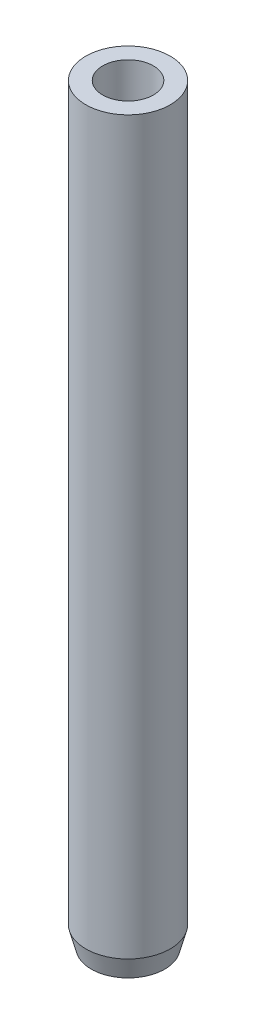
ISO-10303-21;
HEADER;
FILE_DESCRIPTION(('STEP AP214'),'2;1');
FILE_NAME('part.step','',(''),(''),'','','');
FILE_SCHEMA(('AUTOMOTIVE_DESIGN { 1 0 10303 214 1 1 1 1 }'));
ENDSEC;
DATA;
#1=APPLICATION_CONTEXT('core data for automotive mechanical design processes');
#2=APPLICATION_PROTOCOL_DEFINITION('international standard','automotive_design',2000,#1);
#3=PRODUCT_CONTEXT('',#1,'mechanical');
#4=PRODUCT('Part','Part','',(#3));
#5=PRODUCT_RELATED_PRODUCT_CATEGORY('part','',(#4));
#6=PRODUCT_DEFINITION_FORMATION('','',#4);
#7=PRODUCT_DEFINITION_CONTEXT('part definition',#1,'design');
#8=PRODUCT_DEFINITION('design','',#6,#7);
#9=PRODUCT_DEFINITION_SHAPE('','',#8);
#10=(LENGTH_UNIT() NAMED_UNIT(*) SI_UNIT(.MILLI.,.METRE.));
#11=(NAMED_UNIT(*) PLANE_ANGLE_UNIT() SI_UNIT($,.RADIAN.));
#12=(NAMED_UNIT(*) SI_UNIT($,.STERADIAN.) SOLID_ANGLE_UNIT());
#13=UNCERTAINTY_MEASURE_WITH_UNIT(LENGTH_MEASURE(1.E-05),#10,'distance_accuracy_value','');
#14=(GEOMETRIC_REPRESENTATION_CONTEXT(3) GLOBAL_UNCERTAINTY_ASSIGNED_CONTEXT((#13)) GLOBAL_UNIT_ASSIGNED_CONTEXT((#10,
#11,#12)) REPRESENTATION_CONTEXT('',''));
#15=CARTESIAN_POINT('',(0.,0.,0.));
#16=DIRECTION('',(0.,0.,1.));
#17=DIRECTION('',(1.,0.,0.));
#18=AXIS2_PLACEMENT_3D('',#15,#16,#17);
#19=CARTESIAN_POINT('',(0.,4.4956921938165,0.));
#20=DIRECTION('',(0.,-1.,0.));
#21=DIRECTION('',(-1.,0.,0.));
#22=AXIS2_PLACEMENT_3D('',#19,#20,#21);
#23=SPHERICAL_SURFACE('',#22,4.9956921938165);
#24=CARTESIAN_POINT('',(0.,0.,0.));
#25=DIRECTION('',(0.,-1.,0.));
#26=DIRECTION('',(0.,0.,-1.));
#27=AXIS2_PLACEMENT_3D('',#24,#25,#26);
#28=CIRCLE('',#27,2.17846096908265);
#29=CARTESIAN_POINT('',(0.,0.,-2.17846096908265));
#30=VERTEX_POINT('',#29);
#31=EDGE_CURVE('E10',#30,#30,#28,.T.);
#32=ORIENTED_EDGE('',*,*,#31,.T.);
#33=EDGE_LOOP('',(#32));
#34=FACE_BOUND('',#33,.T.);
#35=ADVANCED_FACE('F35',(#34),#23,.T.);
#36=CARTESIAN_POINT('',(0.,1.2,0.));
#37=DIRECTION('',(0.,1.,0.));
#38=DIRECTION('',(0.,0.,1.));
#39=AXIS2_PLACEMENT_3D('',#36,#37,#38);
#40=CONICAL_SURFACE('',#39,2.49999999999999,0.26179938779915);
#41=ORIENTED_EDGE('',*,*,#31,.F.);
#42=EDGE_LOOP('',(#41));
#43=FACE_BOUND('',#42,.T.);
#44=CARTESIAN_POINT('',(0.,1.2,0.));
#45=DIRECTION('',(0.,-1.,0.));
#46=DIRECTION('',(0.,0.,-1.));
#47=AXIS2_PLACEMENT_3D('',#44,#45,#46);
#48=CIRCLE('',#47,2.49999999999999);
#49=CARTESIAN_POINT('',(0.,1.2,-2.49999999999999));
#50=VERTEX_POINT('',#49);
#51=EDGE_CURVE('E41',#50,#50,#48,.T.);
#52=ORIENTED_EDGE('',*,*,#51,.T.);
#53=EDGE_LOOP('',(#52));
#54=FACE_BOUND('',#53,.T.);
#55=ADVANCED_FACE('F70',(#43,#54),#40,.T.);
#56=CARTESIAN_POINT('',(0.,0.,0.));
#57=DIRECTION('',(0.,-1.,0.));
#58=DIRECTION('',(0.,0.,-1.));
#59=AXIS2_PLACEMENT_3D('',#56,#57,#58);
#60=CYLINDRICAL_SURFACE('',#59,2.5);
#61=ORIENTED_EDGE('',*,*,#51,.F.);
#62=EDGE_LOOP('',(#61));
#63=FACE_BOUND('',#62,.T.);
#64=CARTESIAN_POINT('',(0.,44.5,0.));
#65=DIRECTION('',(0.,-1.,0.));
#66=DIRECTION('',(0.,0.,-1.));
#67=AXIS2_PLACEMENT_3D('',#64,#65,#66);
#68=CIRCLE('',#67,2.5);
#69=CARTESIAN_POINT('',(0.,44.5,-2.5));
#70=VERTEX_POINT('',#69);
#71=EDGE_CURVE('E45',#70,#70,#68,.T.);
#72=ORIENTED_EDGE('',*,*,#71,.T.);
#73=EDGE_LOOP('',(#72));
#74=FACE_BOUND('',#73,.T.);
#75=ADVANCED_FACE('F74',(#63,#74),#60,.T.);
#76=CARTESIAN_POINT('',(-1.5,44.5,0.));
#77=DIRECTION('',(0.,-1.,0.));
#78=DIRECTION('',(0.,0.,-1.));
#79=AXIS2_PLACEMENT_3D('',#76,#77,#78);
#80=PLANE('',#79);
#81=ORIENTED_EDGE('',*,*,#71,.F.);
#82=EDGE_LOOP('',(#81));
#83=FACE_BOUND('',#82,.T.);
#84=CARTESIAN_POINT('',(0.,44.5,0.));
#85=DIRECTION('',(0.,-1.,0.));
#86=DIRECTION('',(0.,0.,-1.));
#87=AXIS2_PLACEMENT_3D('',#84,#85,#86);
#88=CIRCLE('',#87,1.5);
#89=CARTESIAN_POINT('',(0.,44.5,-1.5));
#90=VERTEX_POINT('',#89);
#91=EDGE_CURVE('E49',#90,#90,#88,.T.);
#92=ORIENTED_EDGE('',*,*,#91,.T.);
#93=EDGE_LOOP('',(#92));
#94=FACE_BOUND('',#93,.T.);
#95=ADVANCED_FACE('F66',(#83,#94),#80,.F.);
#96=CARTESIAN_POINT('',(0.,0.,0.));
#97=DIRECTION('',(0.,-1.,0.));
#98=DIRECTION('',(0.,0.,-1.));
#99=AXIS2_PLACEMENT_3D('',#96,#97,#98);
#100=CYLINDRICAL_SURFACE('',#99,1.5);
#101=ORIENTED_EDGE('',*,*,#91,.F.);
#102=EDGE_LOOP('',(#101));
#103=FACE_BOUND('',#102,.T.);
#104=CARTESIAN_POINT('',(0.,38.5,0.));
#105=DIRECTION('',(0.,-1.,0.));
#106=DIRECTION('',(0.,0.,-1.));
#107=AXIS2_PLACEMENT_3D('',#104,#105,#106);
#108=CIRCLE('',#107,1.5);
#109=CARTESIAN_POINT('',(0.,38.5,-1.5));
#110=VERTEX_POINT('',#109);
#111=EDGE_CURVE('E54',#110,#110,#108,.T.);
#112=ORIENTED_EDGE('',*,*,#111,.T.);
#113=EDGE_LOOP('',(#112));
#114=FACE_BOUND('',#113,.T.);
#115=ADVANCED_FACE('F58',(#103,#114),#100,.F.);
#116=CARTESIAN_POINT('',(0.,38.5,0.));
#117=DIRECTION('',(0.,-1.,0.));
#118=DIRECTION('',(0.,0.,-1.));
#119=AXIS2_PLACEMENT_3D('',#116,#117,#118);
#120=PLANE('',#119);
#121=ORIENTED_EDGE('',*,*,#111,.F.);
#122=EDGE_LOOP('',(#121));
#123=FACE_BOUND('',#122,.T.);
#124=ADVANCED_FACE('F60',(#123),#120,.F.);
#125=CLOSED_SHELL('',(#35,#55,#75,#95,#115,#124));
#126=MANIFOLD_SOLID_BREP('B2',#125);
#127=ADVANCED_BREP_SHAPE_REPRESENTATION('',(#18,#126),#14);
#128=SHAPE_DEFINITION_REPRESENTATION(#9,#127);
ENDSEC;
END-ISO-10303-21;
